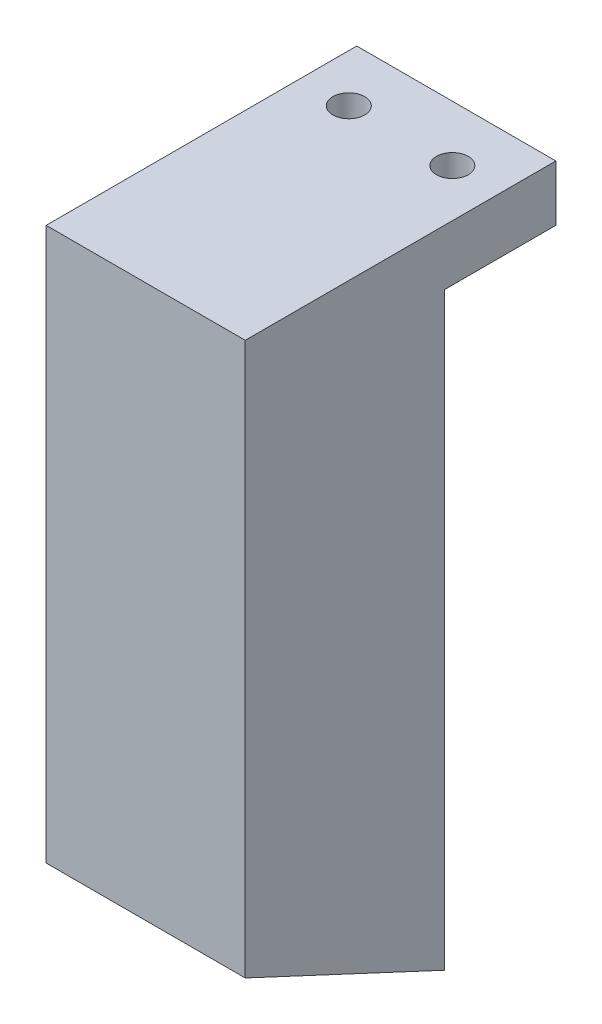
ISO-10303-21;
HEADER;
FILE_DESCRIPTION(('STEP AP214'),'2;1');
FILE_NAME('part.step','',(''),(''),'','','');
FILE_SCHEMA(('AUTOMOTIVE_DESIGN { 1 0 10303 214 1 1 1 1 }'));
ENDSEC;
DATA;
#1=APPLICATION_CONTEXT('core data for automotive mechanical design processes');
#2=APPLICATION_PROTOCOL_DEFINITION('international standard','automotive_design',2000,#1);
#3=PRODUCT_CONTEXT('',#1,'mechanical');
#4=PRODUCT('Part','Part','',(#3));
#5=PRODUCT_RELATED_PRODUCT_CATEGORY('part','',(#4));
#6=PRODUCT_DEFINITION_FORMATION('','',#4);
#7=PRODUCT_DEFINITION_CONTEXT('part definition',#1,'design');
#8=PRODUCT_DEFINITION('design','',#6,#7);
#9=PRODUCT_DEFINITION_SHAPE('','',#8);
#10=(LENGTH_UNIT() NAMED_UNIT(*) SI_UNIT(.MILLI.,.METRE.));
#11=(NAMED_UNIT(*) PLANE_ANGLE_UNIT() SI_UNIT($,.RADIAN.));
#12=(NAMED_UNIT(*) SI_UNIT($,.STERADIAN.) SOLID_ANGLE_UNIT());
#13=UNCERTAINTY_MEASURE_WITH_UNIT(LENGTH_MEASURE(1.E-05),#10,'distance_accuracy_value','');
#14=(GEOMETRIC_REPRESENTATION_CONTEXT(3) GLOBAL_UNCERTAINTY_ASSIGNED_CONTEXT((#13)) GLOBAL_UNIT_ASSIGNED_CONTEXT((#10,
#11,#12)) REPRESENTATION_CONTEXT('',''));
#15=CARTESIAN_POINT('',(0.,0.,0.));
#16=DIRECTION('',(0.,0.,1.));
#17=DIRECTION('',(1.,0.,0.));
#18=AXIS2_PLACEMENT_3D('',#15,#16,#17);
#19=CARTESIAN_POINT('',(-76.9047619047619,81.,-16.0714285714286));
#20=DIRECTION('',(0.,0.,1.));
#21=DIRECTION('',(1.,0.,0.));
#22=AXIS2_PLACEMENT_3D('',#19,#20,#21);
#23=PLANE('',#22);
#24=CARTESIAN_POINT('',(-64.4047619047619,32.6404446349412,-16.0714285714286));
#25=DIRECTION('',(0.,0.,1.));
#26=DIRECTION('',(0.,-1.,0.));
#27=AXIS2_PLACEMENT_3D('',#24,#25,#26);
#28=ELLIPSE('',#27,3.54930237472879,1.5);
#29=CARTESIAN_POINT('',(-64.4047619047619,29.0911422602125,-16.0714285714286));
#30=VERTEX_POINT('',#29);
#31=EDGE_CURVE('E128',#30,#30,#28,.T.);
#32=ORIENTED_EDGE('',*,*,#31,.T.);
#33=EDGE_LOOP('',(#32));
#34=FACE_BOUND('',#33,.T.);
#35=DIRECTION('',(-1.,0.,0.));
#36=VECTOR('',#35,1.);
#37=CARTESIAN_POINT('',(-76.9047619047619,74.,-16.0714285714286));
#38=LINE('',#37,#36);
#39=CARTESIAN_POINT('',(-51.9047619047619,74.,-16.0714285714286));
#40=VERTEX_POINT('',#39);
#41=CARTESIAN_POINT('',(-76.9047619047619,74.,-16.0714285714286));
#42=VERTEX_POINT('',#41);
#43=EDGE_CURVE('E48',#40,#42,#38,.T.);
#44=ORIENTED_EDGE('',*,*,#43,.F.);
#45=DIRECTION('',(0.,-1.,0.));
#46=VECTOR('',#45,1.);
#47=CARTESIAN_POINT('',(-51.9047619047619,81.,-16.0714285714286));
#48=LINE('',#47,#46);
#49=CARTESIAN_POINT('',(-51.9047619047619,0.,-16.0714285714286));
#50=VERTEX_POINT('',#49);
#51=EDGE_CURVE('E141',#40,#50,#48,.T.);
#52=ORIENTED_EDGE('',*,*,#51,.T.);
#53=DIRECTION('',(-1.,0.,0.));
#54=VECTOR('',#53,1.);
#55=CARTESIAN_POINT('',(-76.9047619047619,0.,-16.0714285714286));
#56=LINE('',#55,#54);
#57=CARTESIAN_POINT('',(-76.9047619047619,0.,-16.0714285714286));
#58=VERTEX_POINT('',#57);
#59=EDGE_CURVE('E97',#50,#58,#56,.T.);
#60=ORIENTED_EDGE('',*,*,#59,.T.);
#61=DIRECTION('',(0.,-1.,0.));
#62=VECTOR('',#61,1.);
#63=CARTESIAN_POINT('',(-76.9047619047619,81.,-16.0714285714286));
#64=LINE('',#63,#62);
#65=EDGE_CURVE('E67',#42,#58,#64,.T.);
#66=ORIENTED_EDGE('',*,*,#65,.F.);
#67=EDGE_LOOP('',(#44,#52,#60,#66));
#68=FACE_BOUND('',#67,.T.);
#69=ADVANCED_FACE('F33',(#34,#68),#23,.F.);
#70=CARTESIAN_POINT('',(-76.9047619047619,81.,-16.0714285714286));
#71=DIRECTION('',(1.,0.,0.));
#72=DIRECTION('',(0.,0.,-1.));
#73=AXIS2_PLACEMENT_3D('',#70,#71,#72);
#74=PLANE('',#73);
#75=DIRECTION('',(0.,0.,1.));
#76=VECTOR('',#75,1.);
#77=CARTESIAN_POINT('',(-76.9047619047619,81.,-16.0714285714286));
#78=LINE('',#77,#76);
#79=CARTESIAN_POINT('',(-76.9047619047619,81.,-30.0714285714286));
#80=VERTEX_POINT('',#79);
#81=CARTESIAN_POINT('',(-76.9047619047619,81.,8.92857142857143));
#82=VERTEX_POINT('',#81);
#83=EDGE_CURVE('E93',#80,#82,#78,.T.);
#84=ORIENTED_EDGE('',*,*,#83,.F.);
#85=DIRECTION('',(0.,1.,0.));
#86=VECTOR('',#85,1.);
#87=CARTESIAN_POINT('',(-76.9047619047619,81.,-30.0714285714286));
#88=LINE('',#87,#86);
#89=CARTESIAN_POINT('',(-76.9047619047619,74.,-30.0714285714286));
#90=VERTEX_POINT('',#89);
#91=EDGE_CURVE('E96',#90,#80,#88,.T.);
#92=ORIENTED_EDGE('',*,*,#91,.F.);
#93=DIRECTION('',(0.,0.,1.));
#94=VECTOR('',#93,1.);
#95=CARTESIAN_POINT('',(-76.9047619047619,74.,-30.0714285714286));
#96=LINE('',#95,#94);
#97=EDGE_CURVE('E119',#90,#42,#96,.T.);
#98=ORIENTED_EDGE('',*,*,#97,.T.);
#99=ORIENTED_EDGE('',*,*,#65,.T.);
#100=DIRECTION('',(0.,0.422618261740694,0.906307787036653));
#101=VECTOR('',#100,1.);
#102=CARTESIAN_POINT('',(-76.9047619047619,14.4671018076947,14.9533713748897));
#103=LINE('',#102,#101);
#104=CARTESIAN_POINT('',(-76.9047619047619,11.6576914538748,8.92857142857143));
#105=VERTEX_POINT('',#104);
#106=EDGE_CURVE('E134',#58,#105,#103,.T.);
#107=ORIENTED_EDGE('',*,*,#106,.T.);
#108=DIRECTION('',(0.,-1.,0.));
#109=VECTOR('',#108,1.);
#110=CARTESIAN_POINT('',(-76.9047619047619,81.,8.92857142857143));
#111=LINE('',#110,#109);
#112=EDGE_CURVE('E11',#82,#105,#111,.T.);
#113=ORIENTED_EDGE('',*,*,#112,.F.);
#114=EDGE_LOOP('',(#84,#92,#98,#99,#107,#113));
#115=FACE_BOUND('',#114,.T.);
#116=ADVANCED_FACE('F35',(#115),#74,.F.);
#117=CARTESIAN_POINT('',(-76.9047619047619,81.,8.92857142857143));
#118=DIRECTION('',(0.,0.,-1.));
#119=DIRECTION('',(-1.,0.,0.));
#120=AXIS2_PLACEMENT_3D('',#117,#118,#119);
#121=PLANE('',#120);
#122=ORIENTED_EDGE('',*,*,#112,.T.);
#123=DIRECTION('',(1.,0.,0.));
#124=VECTOR('',#123,1.);
#125=CARTESIAN_POINT('',(-91.9047619047619,11.6576914538748,8.92857142857143));
#126=LINE('',#125,#124);
#127=CARTESIAN_POINT('',(-51.9047619047619,11.6576914538748,8.92857142857143));
#128=VERTEX_POINT('',#127);
#129=EDGE_CURVE('E74',#105,#128,#126,.T.);
#130=ORIENTED_EDGE('',*,*,#129,.T.);
#131=DIRECTION('',(0.,-1.,0.));
#132=VECTOR('',#131,1.);
#133=CARTESIAN_POINT('',(-51.9047619047619,81.,8.92857142857143));
#134=LINE('',#133,#132);
#135=CARTESIAN_POINT('',(-51.9047619047619,81.,8.92857142857143));
#136=VERTEX_POINT('',#135);
#137=EDGE_CURVE('E41',#136,#128,#134,.T.);
#138=ORIENTED_EDGE('',*,*,#137,.F.);
#139=DIRECTION('',(1.,0.,0.));
#140=VECTOR('',#139,1.);
#141=CARTESIAN_POINT('',(-76.9047619047619,81.,8.92857142857143));
#142=LINE('',#141,#140);
#143=EDGE_CURVE('E57',#82,#136,#142,.T.);
#144=ORIENTED_EDGE('',*,*,#143,.F.);
#145=EDGE_LOOP('',(#122,#130,#138,#144));
#146=FACE_BOUND('',#145,.T.);
#147=ADVANCED_FACE('F147',(#146),#121,.F.);
#148=CARTESIAN_POINT('',(-51.9047619047619,81.,-16.0714285714286));
#149=DIRECTION('',(-1.,0.,0.));
#150=DIRECTION('',(0.,0.,1.));
#151=AXIS2_PLACEMENT_3D('',#148,#149,#150);
#152=PLANE('',#151);
#153=ORIENTED_EDGE('',*,*,#137,.T.);
#154=DIRECTION('',(0.,0.422618261740693,0.906307787036653));
#155=VECTOR('',#154,1.);
#156=CARTESIAN_POINT('',(-51.9047619047619,11.6576914538748,8.92857142857143));
#157=LINE('',#156,#155);
#158=EDGE_CURVE('E131',#50,#128,#157,.T.);
#159=ORIENTED_EDGE('',*,*,#158,.F.);
#160=ORIENTED_EDGE('',*,*,#51,.F.);
#161=DIRECTION('',(0.,0.,1.));
#162=VECTOR('',#161,1.);
#163=CARTESIAN_POINT('',(-51.9047619047619,74.,-30.0714285714286));
#164=LINE('',#163,#162);
#165=CARTESIAN_POINT('',(-51.9047619047619,74.,-30.0714285714286));
#166=VERTEX_POINT('',#165);
#167=EDGE_CURVE('E122',#166,#40,#164,.T.);
#168=ORIENTED_EDGE('',*,*,#167,.F.);
#169=DIRECTION('',(0.,-1.,0.));
#170=VECTOR('',#169,1.);
#171=CARTESIAN_POINT('',(-51.9047619047619,81.,-30.0714285714286));
#172=LINE('',#171,#170);
#173=CARTESIAN_POINT('',(-51.9047619047619,81.,-30.0714285714286));
#174=VERTEX_POINT('',#173);
#175=EDGE_CURVE('E106',#174,#166,#172,.T.);
#176=ORIENTED_EDGE('',*,*,#175,.F.);
#177=DIRECTION('',(0.,0.,-1.));
#178=VECTOR('',#177,1.);
#179=CARTESIAN_POINT('',(-51.9047619047619,81.,-16.0714285714286));
#180=LINE('',#179,#178);
#181=EDGE_CURVE('E103',#136,#174,#180,.T.);
#182=ORIENTED_EDGE('',*,*,#181,.F.);
#183=EDGE_LOOP('',(#153,#159,#160,#168,#176,#182));
#184=FACE_BOUND('',#183,.T.);
#185=ADVANCED_FACE('F145',(#184),#152,.F.);
#186=CARTESIAN_POINT('',(0.,81.,0.));
#187=DIRECTION('',(0.,1.,0.));
#188=DIRECTION('',(0.,0.,1.));
#189=AXIS2_PLACEMENT_3D('',#186,#187,#188);
#190=PLANE('',#189);
#191=CARTESIAN_POINT('',(-70.9047619047619,81.,-23.0714285714286));
#192=DIRECTION('',(0.,1.,0.));
#193=DIRECTION('',(0.,0.,1.));
#194=AXIS2_PLACEMENT_3D('',#191,#192,#193);
#195=CIRCLE('',#194,2.);
#196=CARTESIAN_POINT('',(-70.9047619047619,81.,-21.0714285714286));
#197=VERTEX_POINT('',#196);
#198=EDGE_CURVE('E113',#197,#197,#195,.T.);
#199=ORIENTED_EDGE('',*,*,#198,.F.);
#200=EDGE_LOOP('',(#199));
#201=FACE_BOUND('',#200,.T.);
#202=CARTESIAN_POINT('',(-57.9047619047619,81.,-23.0714285714286));
#203=DIRECTION('',(0.,1.,0.));
#204=DIRECTION('',(0.,0.,1.));
#205=AXIS2_PLACEMENT_3D('',#202,#203,#204);
#206=CIRCLE('',#205,2.);
#207=CARTESIAN_POINT('',(-57.9047619047619,81.,-21.0714285714286));
#208=VERTEX_POINT('',#207);
#209=EDGE_CURVE('E192',#208,#208,#206,.T.);
#210=ORIENTED_EDGE('',*,*,#209,.F.);
#211=EDGE_LOOP('',(#210));
#212=FACE_BOUND('',#211,.T.);
#213=ORIENTED_EDGE('',*,*,#83,.T.);
#214=ORIENTED_EDGE('',*,*,#143,.T.);
#215=ORIENTED_EDGE('',*,*,#181,.T.);
#216=DIRECTION('',(1.,0.,0.));
#217=VECTOR('',#216,1.);
#218=CARTESIAN_POINT('',(-76.9047619047619,81.,-30.0714285714286));
#219=LINE('',#218,#217);
#220=EDGE_CURVE('E100',#80,#174,#219,.T.);
#221=ORIENTED_EDGE('',*,*,#220,.F.);
#222=EDGE_LOOP('',(#213,#214,#215,#221));
#223=FACE_BOUND('',#222,.T.);
#224=ADVANCED_FACE('F101',(#201,#212,#223),#190,.T.);
#225=CARTESIAN_POINT('',(-91.9047619047619,11.6576914538748,8.92857142857143));
#226=DIRECTION('',(0.,0.906307787036653,-0.422618261740693));
#227=DIRECTION('',(0.,0.422618261740694,0.906307787036653));
#228=AXIS2_PLACEMENT_3D('',#225,#226,#227);
#229=PLANE('',#228);
#230=CARTESIAN_POINT('',(-64.4047619047619,5.8297856244706,-3.56941295466401));
#231=DIRECTION('',(0.,-0.906307787036653,0.422618261740693));
#232=DIRECTION('',(0.,-0.422618261740693,-0.906307787036653));
#233=AXIS2_PLACEMENT_3D('',#230,#231,#232);
#234=CIRCLE('',#233,1.5);
#235=CARTESIAN_POINT('',(-64.4047619047619,5.19585823185957,-4.92887463521898));
#236=VERTEX_POINT('',#235);
#237=EDGE_CURVE('E125',#236,#236,#234,.T.);
#238=ORIENTED_EDGE('',*,*,#237,.F.);
#239=EDGE_LOOP('',(#238));
#240=FACE_BOUND('',#239,.T.);
#241=ORIENTED_EDGE('',*,*,#59,.F.);
#242=ORIENTED_EDGE('',*,*,#158,.T.);
#243=ORIENTED_EDGE('',*,*,#129,.F.);
#244=ORIENTED_EDGE('',*,*,#106,.F.);
#245=EDGE_LOOP('',(#241,#242,#243,#244));
#246=FACE_BOUND('',#245,.T.);
#247=ADVANCED_FACE('F162',(#240,#246),#229,.F.);
#248=CARTESIAN_POINT('',(-64.4047619047619,38.4568659577901,-18.783670377329));
#249=DIRECTION('',(0.,-0.906307787036653,0.422618261740693));
#250=DIRECTION('',(0.,-0.422618261740693,-0.906307787036653));
#251=AXIS2_PLACEMENT_3D('',#248,#249,#250);
#252=CYLINDRICAL_SURFACE('',#251,1.5);
#253=ORIENTED_EDGE('',*,*,#237,.T.);
#254=EDGE_LOOP('',(#253));
#255=FACE_BOUND('',#254,.T.);
#256=ORIENTED_EDGE('',*,*,#31,.F.);
#257=EDGE_LOOP('',(#256));
#258=FACE_BOUND('',#257,.T.);
#259=ADVANCED_FACE('F166',(#255,#258),#252,.F.);
#260=CARTESIAN_POINT('',(-76.9047619047619,74.,-30.0714285714286));
#261=DIRECTION('',(0.,1.,0.));
#262=DIRECTION('',(0.,0.,1.));
#263=AXIS2_PLACEMENT_3D('',#260,#261,#262);
#264=PLANE('',#263);
#265=CARTESIAN_POINT('',(-70.9047619047619,74.,-23.0714285714286));
#266=DIRECTION('',(0.,-1.,0.));
#267=DIRECTION('',(0.,0.,-1.));
#268=AXIS2_PLACEMENT_3D('',#265,#266,#267);
#269=CIRCLE('',#268,2.);
#270=CARTESIAN_POINT('',(-70.9047619047619,74.,-25.0714285714286));
#271=VERTEX_POINT('',#270);
#272=EDGE_CURVE('E191',#271,#271,#269,.T.);
#273=ORIENTED_EDGE('',*,*,#272,.F.);
#274=EDGE_LOOP('',(#273));
#275=FACE_BOUND('',#274,.T.);
#276=CARTESIAN_POINT('',(-57.9047619047619,74.,-23.0714285714286));
#277=DIRECTION('',(0.,-1.,0.));
#278=DIRECTION('',(0.,0.,-1.));
#279=AXIS2_PLACEMENT_3D('',#276,#277,#278);
#280=CIRCLE('',#279,2.);
#281=CARTESIAN_POINT('',(-57.9047619047619,74.,-25.0714285714286));
#282=VERTEX_POINT('',#281);
#283=EDGE_CURVE('E193',#282,#282,#280,.T.);
#284=ORIENTED_EDGE('',*,*,#283,.F.);
#285=EDGE_LOOP('',(#284));
#286=FACE_BOUND('',#285,.T.);
#287=ORIENTED_EDGE('',*,*,#43,.T.);
#288=ORIENTED_EDGE('',*,*,#97,.F.);
#289=DIRECTION('',(-1.,0.,0.));
#290=VECTOR('',#289,1.);
#291=CARTESIAN_POINT('',(-76.9047619047619,74.,-30.0714285714286));
#292=LINE('',#291,#290);
#293=EDGE_CURVE('E110',#166,#90,#292,.T.);
#294=ORIENTED_EDGE('',*,*,#293,.F.);
#295=ORIENTED_EDGE('',*,*,#167,.T.);
#296=EDGE_LOOP('',(#287,#288,#294,#295));
#297=FACE_BOUND('',#296,.T.);
#298=ADVANCED_FACE('F170',(#275,#286,#297),#264,.F.);
#299=CARTESIAN_POINT('',(0.,0.,-30.0714285714286));
#300=DIRECTION('',(0.,0.,1.));
#301=DIRECTION('',(1.,0.,0.));
#302=AXIS2_PLACEMENT_3D('',#299,#300,#301);
#303=PLANE('',#302);
#304=ORIENTED_EDGE('',*,*,#91,.T.);
#305=ORIENTED_EDGE('',*,*,#220,.T.);
#306=ORIENTED_EDGE('',*,*,#175,.T.);
#307=ORIENTED_EDGE('',*,*,#293,.T.);
#308=EDGE_LOOP('',(#304,#305,#306,#307));
#309=FACE_BOUND('',#308,.T.);
#310=ADVANCED_FACE('F108',(#309),#303,.F.);
#311=CARTESIAN_POINT('',(-57.9047619047619,88.,-23.0714285714286));
#312=DIRECTION('',(0.,-1.,0.));
#313=DIRECTION('',(0.,0.,-1.));
#314=AXIS2_PLACEMENT_3D('',#311,#312,#313);
#315=CYLINDRICAL_SURFACE('',#314,2.);
#316=ORIENTED_EDGE('',*,*,#209,.T.);
#317=EDGE_LOOP('',(#316));
#318=FACE_BOUND('',#317,.T.);
#319=ORIENTED_EDGE('',*,*,#283,.T.);
#320=EDGE_LOOP('',(#319));
#321=FACE_BOUND('',#320,.T.);
#322=ADVANCED_FACE('F177',(#318,#321),#315,.F.);
#323=CARTESIAN_POINT('',(-70.9047619047619,88.,-23.0714285714286));
#324=DIRECTION('',(0.,-1.,0.));
#325=DIRECTION('',(0.,0.,-1.));
#326=AXIS2_PLACEMENT_3D('',#323,#324,#325);
#327=CYLINDRICAL_SURFACE('',#326,2.);
#328=ORIENTED_EDGE('',*,*,#198,.T.);
#329=EDGE_LOOP('',(#328));
#330=FACE_BOUND('',#329,.T.);
#331=ORIENTED_EDGE('',*,*,#272,.T.);
#332=EDGE_LOOP('',(#331));
#333=FACE_BOUND('',#332,.T.);
#334=ADVANCED_FACE('F180',(#330,#333),#327,.F.);
#335=CLOSED_SHELL('',(#69,#116,#147,#185,#224,#247,#259,#298,#310,#322,#334));
#336=MANIFOLD_SOLID_BREP('B2',#335);
#337=ADVANCED_BREP_SHAPE_REPRESENTATION('',(#18,#336),#14);
#338=SHAPE_DEFINITION_REPRESENTATION(#9,#337);
ENDSEC;
END-ISO-10303-21;
